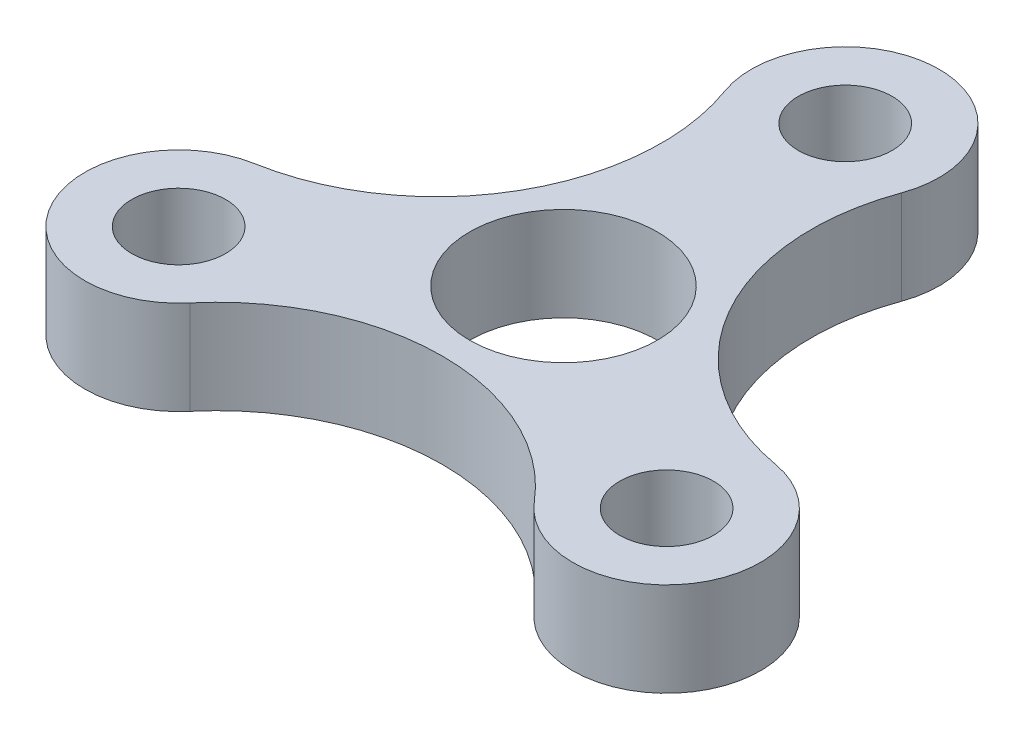
ISO-10303-21;
HEADER;
FILE_DESCRIPTION(('STEP AP214'),'2;1');
FILE_NAME('part.step','',(''),(''),'','','');
FILE_SCHEMA(('AUTOMOTIVE_DESIGN { 1 0 10303 214 1 1 1 1 }'));
ENDSEC;
DATA;
#1=APPLICATION_CONTEXT('core data for automotive mechanical design processes');
#2=APPLICATION_PROTOCOL_DEFINITION('international standard','automotive_design',2000,#1);
#3=PRODUCT_CONTEXT('',#1,'mechanical');
#4=PRODUCT('Part','Part','',(#3));
#5=PRODUCT_RELATED_PRODUCT_CATEGORY('part','',(#4));
#6=PRODUCT_DEFINITION_FORMATION('','',#4);
#7=PRODUCT_DEFINITION_CONTEXT('part definition',#1,'design');
#8=PRODUCT_DEFINITION('design','',#6,#7);
#9=PRODUCT_DEFINITION_SHAPE('','',#8);
#10=(LENGTH_UNIT() NAMED_UNIT(*) SI_UNIT(.MILLI.,.METRE.));
#11=(NAMED_UNIT(*) PLANE_ANGLE_UNIT() SI_UNIT($,.RADIAN.));
#12=(NAMED_UNIT(*) SI_UNIT($,.STERADIAN.) SOLID_ANGLE_UNIT());
#13=UNCERTAINTY_MEASURE_WITH_UNIT(LENGTH_MEASURE(1.E-05),#10,'distance_accuracy_value','');
#14=(GEOMETRIC_REPRESENTATION_CONTEXT(3) GLOBAL_UNCERTAINTY_ASSIGNED_CONTEXT((#13)) GLOBAL_UNIT_ASSIGNED_CONTEXT((#10,
#11,#12)) REPRESENTATION_CONTEXT('',''));
#15=CARTESIAN_POINT('',(0.,0.,0.));
#16=DIRECTION('',(0.,0.,1.));
#17=DIRECTION('',(1.,0.,0.));
#18=AXIS2_PLACEMENT_3D('',#15,#16,#17);
#19=CARTESIAN_POINT('',(0.,10.,-30.));
#20=DIRECTION('',(0.,-1.,0.));
#21=DIRECTION('',(0.,0.,-1.));
#22=AXIS2_PLACEMENT_3D('',#19,#20,#21);
#23=CYLINDRICAL_SURFACE('',#22,10.);
#24=CARTESIAN_POINT('',(0.,0.,-30.));
#25=DIRECTION('',(0.,1.,0.));
#26=DIRECTION('',(0.,0.,1.));
#27=AXIS2_PLACEMENT_3D('',#24,#25,#26);
#28=CIRCLE('',#27,10.);
#29=CARTESIAN_POINT('',(9.40050719485576,0.,-26.589653319754));
#30=VERTEX_POINT('',#29);
#31=CARTESIAN_POINT('',(-9.40050719485577,0.,-26.589653319754));
#32=VERTEX_POINT('',#31);
#33=EDGE_CURVE('E149',#30,#32,#28,.T.);
#34=ORIENTED_EDGE('',*,*,#33,.T.);
#35=DIRECTION('',(0.,-1.,0.));
#36=VECTOR('',#35,1.);
#37=CARTESIAN_POINT('',(-9.40050719485577,10.,-26.589653319754));
#38=LINE('',#37,#36);
#39=CARTESIAN_POINT('',(-9.40050719485577,10.,-26.589653319754));
#40=VERTEX_POINT('',#39);
#41=EDGE_CURVE('E11',#40,#32,#38,.T.);
#42=ORIENTED_EDGE('',*,*,#41,.F.);
#43=CARTESIAN_POINT('',(0.,10.,-30.));
#44=DIRECTION('',(0.,1.,0.));
#45=DIRECTION('',(0.,0.,1.));
#46=AXIS2_PLACEMENT_3D('',#43,#44,#45);
#47=CIRCLE('',#46,10.);
#48=CARTESIAN_POINT('',(9.40050719485576,10.,-26.589653319754));
#49=VERTEX_POINT('',#48);
#50=EDGE_CURVE('E91',#49,#40,#47,.T.);
#51=ORIENTED_EDGE('',*,*,#50,.F.);
#52=DIRECTION('',(0.,-1.,0.));
#53=VECTOR('',#52,1.);
#54=CARTESIAN_POINT('',(9.40050719485576,10.,-26.589653319754));
#55=LINE('',#54,#53);
#56=EDGE_CURVE('E59',#49,#30,#55,.T.);
#57=ORIENTED_EDGE('',*,*,#56,.T.);
#58=EDGE_LOOP('',(#34,#42,#51,#57));
#59=FACE_BOUND('',#58,.T.);
#60=ADVANCED_FACE('F41',(#59),#23,.T.);
#61=CARTESIAN_POINT('',(-31.9103605515933,10.,-18.4234552544004));
#62=DIRECTION('',(0.,-1.,0.));
#63=DIRECTION('',(0.,0.,-1.));
#64=AXIS2_PLACEMENT_3D('',#61,#62,#63);
#65=CYLINDRICAL_SURFACE('',#64,23.9453604897568);
#66=CARTESIAN_POINT('',(-31.9103605515933,0.,-18.4234552544004));
#67=DIRECTION('',(0.,1.,0.));
#68=DIRECTION('',(0.,0.,1.));
#69=AXIS2_PLACEMENT_3D('',#66,#67,#68);
#70=CIRCLE('',#69,23.9453604897568);
#71=CARTESIAN_POINT('',(-27.7275688501579,0.,5.15374862067481));
#72=VERTEX_POINT('',#71);
#73=EDGE_CURVE('E152',#72,#32,#70,.T.);
#74=ORIENTED_EDGE('',*,*,#73,.F.);
#75=DIRECTION('',(0.,-1.,0.));
#76=VECTOR('',#75,1.);
#77=CARTESIAN_POINT('',(-27.7275688501579,10.,5.15374862067481));
#78=LINE('',#77,#76);
#79=CARTESIAN_POINT('',(-27.7275688501579,10.,5.15374862067481));
#80=VERTEX_POINT('',#79);
#81=EDGE_CURVE('E51',#80,#72,#78,.T.);
#82=ORIENTED_EDGE('',*,*,#81,.F.);
#83=CARTESIAN_POINT('',(-31.9103605515933,10.,-18.4234552544004));
#84=DIRECTION('',(0.,1.,0.));
#85=DIRECTION('',(0.,0.,1.));
#86=AXIS2_PLACEMENT_3D('',#83,#84,#85);
#87=CIRCLE('',#86,23.9453604897568);
#88=EDGE_CURVE('E127',#80,#40,#87,.T.);
#89=ORIENTED_EDGE('',*,*,#88,.T.);
#90=ORIENTED_EDGE('',*,*,#41,.T.);
#91=EDGE_LOOP('',(#74,#82,#89,#90));
#92=FACE_BOUND('',#91,.T.);
#93=ADVANCED_FACE('F197',(#92),#65,.F.);
#94=CARTESIAN_POINT('',(-25.9807621135365,10.,14.9999999999979));
#95=DIRECTION('',(0.,-1.,0.));
#96=DIRECTION('',(0.,0.,-1.));
#97=AXIS2_PLACEMENT_3D('',#94,#95,#96);
#98=CYLINDRICAL_SURFACE('',#97,9.99999999999641);
#99=CARTESIAN_POINT('',(-25.9807621135365,0.,14.9999999999979));
#100=DIRECTION('',(0.,1.,0.));
#101=DIRECTION('',(0.,0.,1.));
#102=AXIS2_PLACEMENT_3D('',#99,#100,#101);
#103=CIRCLE('',#102,9.99999999999641);
#104=CARTESIAN_POINT('',(-18.3270616553063,0.,21.435904699076));
#105=VERTEX_POINT('',#104);
#106=EDGE_CURVE('E156',#72,#105,#103,.T.);
#107=ORIENTED_EDGE('',*,*,#106,.T.);
#108=DIRECTION('',(0.,-1.,0.));
#109=VECTOR('',#108,1.);
#110=CARTESIAN_POINT('',(-18.3270616553063,10.,21.435904699076));
#111=LINE('',#110,#109);
#112=CARTESIAN_POINT('',(-18.3270616553063,10.,21.435904699076));
#113=VERTEX_POINT('',#112);
#114=EDGE_CURVE('E112',#113,#105,#111,.T.);
#115=ORIENTED_EDGE('',*,*,#114,.F.);
#116=CARTESIAN_POINT('',(-25.9807621135365,10.,14.9999999999979));
#117=DIRECTION('',(0.,1.,0.));
#118=DIRECTION('',(0.,0.,1.));
#119=AXIS2_PLACEMENT_3D('',#116,#117,#118);
#120=CIRCLE('',#119,9.99999999999641);
#121=EDGE_CURVE('E122',#80,#113,#120,.T.);
#122=ORIENTED_EDGE('',*,*,#121,.F.);
#123=ORIENTED_EDGE('',*,*,#81,.T.);
#124=EDGE_LOOP('',(#107,#115,#122,#123));
#125=FACE_BOUND('',#124,.T.);
#126=ADVANCED_FACE('F190',(#125),#98,.T.);
#127=CARTESIAN_POINT('',(-3.3133218391157E-13,10.,36.8469105088007));
#128=DIRECTION('',(0.,-1.,0.));
#129=DIRECTION('',(0.,0.,-1.));
#130=AXIS2_PLACEMENT_3D('',#127,#128,#129);
#131=CYLINDRICAL_SURFACE('',#130,23.9453604897568);
#132=CARTESIAN_POINT('',(-3.3133218391157E-13,0.,36.8469105088007));
#133=DIRECTION('',(0.,1.,0.));
#134=DIRECTION('',(0.,0.,1.));
#135=AXIS2_PLACEMENT_3D('',#132,#133,#134);
#136=CIRCLE('',#135,23.9453604897568);
#137=CARTESIAN_POINT('',(18.3270616553002,0.,21.4359046990805));
#138=VERTEX_POINT('',#137);
#139=EDGE_CURVE('E108',#138,#105,#136,.T.);
#140=ORIENTED_EDGE('',*,*,#139,.F.);
#141=DIRECTION('',(0.,-1.,0.));
#142=VECTOR('',#141,1.);
#143=CARTESIAN_POINT('',(18.3270616553002,10.,21.4359046990805));
#144=LINE('',#143,#142);
#145=CARTESIAN_POINT('',(18.3270616553002,10.,21.4359046990805));
#146=VERTEX_POINT('',#145);
#147=EDGE_CURVE('E102',#146,#138,#144,.T.);
#148=ORIENTED_EDGE('',*,*,#147,.F.);
#149=CARTESIAN_POINT('',(-3.3133218391157E-13,10.,36.8469105088007));
#150=DIRECTION('',(0.,1.,0.));
#151=DIRECTION('',(0.,0.,1.));
#152=AXIS2_PLACEMENT_3D('',#149,#150,#151);
#153=CIRCLE('',#152,23.9453604897568);
#154=EDGE_CURVE('E106',#146,#113,#153,.T.);
#155=ORIENTED_EDGE('',*,*,#154,.T.);
#156=ORIENTED_EDGE('',*,*,#114,.T.);
#157=EDGE_LOOP('',(#140,#148,#155,#156));
#158=FACE_BOUND('',#157,.T.);
#159=ADVANCED_FACE('F104',(#158),#131,.F.);
#160=CARTESIAN_POINT('',(25.9807621135331,10.,15.0000000000001));
#161=DIRECTION('',(0.,-1.,0.));
#162=DIRECTION('',(0.,0.,-1.));
#163=AXIS2_PLACEMENT_3D('',#160,#161,#162);
#164=CYLINDRICAL_SURFACE('',#163,10.);
#165=CARTESIAN_POINT('',(25.9807621135331,0.,15.0000000000001));
#166=DIRECTION('',(0.,1.,0.));
#167=DIRECTION('',(0.,0.,1.));
#168=AXIS2_PLACEMENT_3D('',#165,#166,#167);
#169=CIRCLE('',#168,10.);
#170=CARTESIAN_POINT('',(27.7275688501561,0.,5.15374862067364));
#171=VERTEX_POINT('',#170);
#172=EDGE_CURVE('E162',#138,#171,#169,.T.);
#173=ORIENTED_EDGE('',*,*,#172,.T.);
#174=DIRECTION('',(0.,-1.,0.));
#175=VECTOR('',#174,1.);
#176=CARTESIAN_POINT('',(27.7275688501561,10.,5.15374862067364));
#177=LINE('',#176,#175);
#178=CARTESIAN_POINT('',(27.7275688501561,10.,5.15374862067364));
#179=VERTEX_POINT('',#178);
#180=EDGE_CURVE('E79',#179,#171,#177,.T.);
#181=ORIENTED_EDGE('',*,*,#180,.F.);
#182=CARTESIAN_POINT('',(25.9807621135331,10.,15.0000000000001));
#183=DIRECTION('',(0.,1.,0.));
#184=DIRECTION('',(0.,0.,1.));
#185=AXIS2_PLACEMENT_3D('',#182,#183,#184);
#186=CIRCLE('',#185,10.);
#187=EDGE_CURVE('E114',#146,#179,#186,.T.);
#188=ORIENTED_EDGE('',*,*,#187,.F.);
#189=ORIENTED_EDGE('',*,*,#147,.T.);
#190=EDGE_LOOP('',(#173,#181,#188,#189));
#191=FACE_BOUND('',#190,.T.);
#192=ADVANCED_FACE('F115',(#191),#164,.T.);
#193=CARTESIAN_POINT('',(0.,10.,0.));
#194=DIRECTION('',(0.,-1.,0.));
#195=DIRECTION('',(0.,0.,-1.));
#196=AXIS2_PLACEMENT_3D('',#193,#194,#195);
#197=CYLINDRICAL_SURFACE('',#196,10.);
#198=CARTESIAN_POINT('',(0.,10.,0.));
#199=DIRECTION('',(0.,1.,0.));
#200=DIRECTION('',(0.,0.,1.));
#201=AXIS2_PLACEMENT_3D('',#198,#199,#200);
#202=CIRCLE('',#201,10.);
#203=CARTESIAN_POINT('',(0.,10.,10.));
#204=VERTEX_POINT('',#203);
#205=EDGE_CURVE('E137',#204,#204,#202,.T.);
#206=ORIENTED_EDGE('',*,*,#205,.T.);
#207=EDGE_LOOP('',(#206));
#208=FACE_BOUND('',#207,.T.);
#209=CARTESIAN_POINT('',(0.,0.,0.));
#210=DIRECTION('',(0.,1.,0.));
#211=DIRECTION('',(0.,0.,1.));
#212=AXIS2_PLACEMENT_3D('',#209,#210,#211);
#213=CIRCLE('',#212,10.);
#214=CARTESIAN_POINT('',(0.,0.,10.));
#215=VERTEX_POINT('',#214);
#216=EDGE_CURVE('E173',#215,#215,#213,.T.);
#217=ORIENTED_EDGE('',*,*,#216,.F.);
#218=EDGE_LOOP('',(#217));
#219=FACE_BOUND('',#218,.T.);
#220=ADVANCED_FACE('F208',(#208,#219),#197,.F.);
#221=CARTESIAN_POINT('',(25.9807621135331,10.,15.0000000000001));
#222=DIRECTION('',(0.,-1.,0.));
#223=DIRECTION('',(0.,0.,-1.));
#224=AXIS2_PLACEMENT_3D('',#221,#222,#223);
#225=CYLINDRICAL_SURFACE('',#224,5.);
#226=CARTESIAN_POINT('',(25.9807621135331,10.,15.0000000000001));
#227=DIRECTION('',(0.,1.,0.));
#228=DIRECTION('',(0.,0.,1.));
#229=AXIS2_PLACEMENT_3D('',#226,#227,#228);
#230=CIRCLE('',#229,5.);
#231=CARTESIAN_POINT('',(25.9807621135331,10.,20.0000000000001));
#232=VERTEX_POINT('',#231);
#233=EDGE_CURVE('E133',#232,#232,#230,.T.);
#234=ORIENTED_EDGE('',*,*,#233,.T.);
#235=EDGE_LOOP('',(#234));
#236=FACE_BOUND('',#235,.T.);
#237=CARTESIAN_POINT('',(25.9807621135331,0.,15.0000000000001));
#238=DIRECTION('',(0.,1.,0.));
#239=DIRECTION('',(0.,0.,1.));
#240=AXIS2_PLACEMENT_3D('',#237,#238,#239);
#241=CIRCLE('',#240,5.);
#242=CARTESIAN_POINT('',(25.9807621135331,0.,20.0000000000001));
#243=VERTEX_POINT('',#242);
#244=EDGE_CURVE('E169',#243,#243,#241,.T.);
#245=ORIENTED_EDGE('',*,*,#244,.F.);
#246=EDGE_LOOP('',(#245));
#247=FACE_BOUND('',#246,.T.);
#248=ADVANCED_FACE('F200',(#236,#247),#225,.F.);
#249=CARTESIAN_POINT('',(31.9103605515933,10.,-18.4234552544002));
#250=DIRECTION('',(0.,-1.,0.));
#251=DIRECTION('',(0.,0.,-1.));
#252=AXIS2_PLACEMENT_3D('',#249,#250,#251);
#253=CYLINDRICAL_SURFACE('',#252,23.9453604897568);
#254=CARTESIAN_POINT('',(31.9103605515933,0.,-18.4234552544002));
#255=DIRECTION('',(0.,1.,0.));
#256=DIRECTION('',(0.,0.,1.));
#257=AXIS2_PLACEMENT_3D('',#254,#255,#256);
#258=CIRCLE('',#257,23.9453604897568);
#259=EDGE_CURVE('E165',#30,#171,#258,.T.);
#260=ORIENTED_EDGE('',*,*,#259,.F.);
#261=ORIENTED_EDGE('',*,*,#56,.F.);
#262=CARTESIAN_POINT('',(31.9103605515933,10.,-18.4234552544002));
#263=DIRECTION('',(0.,1.,0.));
#264=DIRECTION('',(0.,0.,1.));
#265=AXIS2_PLACEMENT_3D('',#262,#263,#264);
#266=CIRCLE('',#265,23.9453604897568);
#267=EDGE_CURVE('E117',#49,#179,#266,.T.);
#268=ORIENTED_EDGE('',*,*,#267,.T.);
#269=ORIENTED_EDGE('',*,*,#180,.T.);
#270=EDGE_LOOP('',(#260,#261,#268,#269));
#271=FACE_BOUND('',#270,.T.);
#272=ADVANCED_FACE('F198',(#271),#253,.F.);
#273=CARTESIAN_POINT('',(0.,10.,-30.));
#274=DIRECTION('',(0.,-1.,0.));
#275=DIRECTION('',(0.,0.,-1.));
#276=AXIS2_PLACEMENT_3D('',#273,#274,#275);
#277=CYLINDRICAL_SURFACE('',#276,5.);
#278=CARTESIAN_POINT('',(0.,10.,-30.));
#279=DIRECTION('',(0.,1.,0.));
#280=DIRECTION('',(0.,0.,1.));
#281=AXIS2_PLACEMENT_3D('',#278,#279,#280);
#282=CIRCLE('',#281,5.);
#283=CARTESIAN_POINT('',(0.,10.,-25.));
#284=VERTEX_POINT('',#283);
#285=EDGE_CURVE('E181',#284,#284,#282,.T.);
#286=ORIENTED_EDGE('',*,*,#285,.T.);
#287=EDGE_LOOP('',(#286));
#288=FACE_BOUND('',#287,.T.);
#289=CARTESIAN_POINT('',(0.,0.,-30.));
#290=DIRECTION('',(0.,1.,0.));
#291=DIRECTION('',(0.,0.,1.));
#292=AXIS2_PLACEMENT_3D('',#289,#290,#291);
#293=CIRCLE('',#292,5.);
#294=CARTESIAN_POINT('',(0.,0.,-25.));
#295=VERTEX_POINT('',#294);
#296=EDGE_CURVE('E145',#295,#295,#293,.T.);
#297=ORIENTED_EDGE('',*,*,#296,.F.);
#298=EDGE_LOOP('',(#297));
#299=FACE_BOUND('',#298,.T.);
#300=ADVANCED_FACE('F43',(#288,#299),#277,.F.);
#301=CARTESIAN_POINT('',(-25.9807621135333,10.,14.9999999999998));
#302=DIRECTION('',(0.,-1.,0.));
#303=DIRECTION('',(0.,0.,-1.));
#304=AXIS2_PLACEMENT_3D('',#301,#302,#303);
#305=CYLINDRICAL_SURFACE('',#304,5.);
#306=CARTESIAN_POINT('',(-25.9807621135333,10.,14.9999999999998));
#307=DIRECTION('',(0.,1.,0.));
#308=DIRECTION('',(0.,0.,1.));
#309=AXIS2_PLACEMENT_3D('',#306,#307,#308);
#310=CIRCLE('',#309,5.);
#311=CARTESIAN_POINT('',(-25.9807621135333,10.,19.9999999999998));
#312=VERTEX_POINT('',#311);
#313=EDGE_CURVE('E141',#312,#312,#310,.T.);
#314=ORIENTED_EDGE('',*,*,#313,.T.);
#315=EDGE_LOOP('',(#314));
#316=FACE_BOUND('',#315,.T.);
#317=CARTESIAN_POINT('',(-25.9807621135333,0.,14.9999999999998));
#318=DIRECTION('',(0.,1.,0.));
#319=DIRECTION('',(0.,0.,1.));
#320=AXIS2_PLACEMENT_3D('',#317,#318,#319);
#321=CIRCLE('',#320,5.);
#322=CARTESIAN_POINT('',(-25.9807621135333,0.,19.9999999999998));
#323=VERTEX_POINT('',#322);
#324=EDGE_CURVE('E177',#323,#323,#321,.T.);
#325=ORIENTED_EDGE('',*,*,#324,.F.);
#326=EDGE_LOOP('',(#325));
#327=FACE_BOUND('',#326,.T.);
#328=ADVANCED_FACE('F206',(#316,#327),#305,.F.);
#329=CARTESIAN_POINT('',(0.,10.,0.));
#330=DIRECTION('',(0.,1.,0.));
#331=DIRECTION('',(0.,0.,1.));
#332=AXIS2_PLACEMENT_3D('',#329,#330,#331);
#333=PLANE('',#332);
#334=ORIENTED_EDGE('',*,*,#285,.F.);
#335=EDGE_LOOP('',(#334));
#336=FACE_BOUND('',#335,.T.);
#337=ORIENTED_EDGE('',*,*,#50,.T.);
#338=ORIENTED_EDGE('',*,*,#88,.F.);
#339=ORIENTED_EDGE('',*,*,#121,.T.);
#340=ORIENTED_EDGE('',*,*,#154,.F.);
#341=ORIENTED_EDGE('',*,*,#187,.T.);
#342=ORIENTED_EDGE('',*,*,#267,.F.);
#343=EDGE_LOOP('',(#337,#338,#339,#340,#341,#342));
#344=FACE_BOUND('',#343,.T.);
#345=ORIENTED_EDGE('',*,*,#233,.F.);
#346=EDGE_LOOP('',(#345));
#347=FACE_BOUND('',#346,.T.);
#348=ORIENTED_EDGE('',*,*,#205,.F.);
#349=EDGE_LOOP('',(#348));
#350=FACE_BOUND('',#349,.T.);
#351=ORIENTED_EDGE('',*,*,#313,.F.);
#352=EDGE_LOOP('',(#351));
#353=FACE_BOUND('',#352,.T.);
#354=ADVANCED_FACE('F119',(#336,#344,#347,#350,#353),#333,.T.);
#355=CARTESIAN_POINT('',(0.,0.,0.));
#356=DIRECTION('',(0.,1.,0.));
#357=DIRECTION('',(0.,0.,1.));
#358=AXIS2_PLACEMENT_3D('',#355,#356,#357);
#359=PLANE('',#358);
#360=ORIENTED_EDGE('',*,*,#296,.T.);
#361=EDGE_LOOP('',(#360));
#362=FACE_BOUND('',#361,.T.);
#363=ORIENTED_EDGE('',*,*,#33,.F.);
#364=ORIENTED_EDGE('',*,*,#259,.T.);
#365=ORIENTED_EDGE('',*,*,#172,.F.);
#366=ORIENTED_EDGE('',*,*,#139,.T.);
#367=ORIENTED_EDGE('',*,*,#106,.F.);
#368=ORIENTED_EDGE('',*,*,#73,.T.);
#369=EDGE_LOOP('',(#363,#364,#365,#366,#367,#368));
#370=FACE_BOUND('',#369,.T.);
#371=ORIENTED_EDGE('',*,*,#244,.T.);
#372=EDGE_LOOP('',(#371));
#373=FACE_BOUND('',#372,.T.);
#374=ORIENTED_EDGE('',*,*,#216,.T.);
#375=EDGE_LOOP('',(#374));
#376=FACE_BOUND('',#375,.T.);
#377=ORIENTED_EDGE('',*,*,#324,.T.);
#378=EDGE_LOOP('',(#377));
#379=FACE_BOUND('',#378,.T.);
#380=ADVANCED_FACE('F195',(#362,#370,#373,#376,#379),#359,.F.);
#381=CLOSED_SHELL('',(#60,#93,#126,#159,#192,#220,#248,#272,#300,#328,#354,#380));
#382=MANIFOLD_SOLID_BREP('B2',#381);
#383=ADVANCED_BREP_SHAPE_REPRESENTATION('',(#18,#382),#14);
#384=SHAPE_DEFINITION_REPRESENTATION(#9,#383);
ENDSEC;
END-ISO-10303-21;
